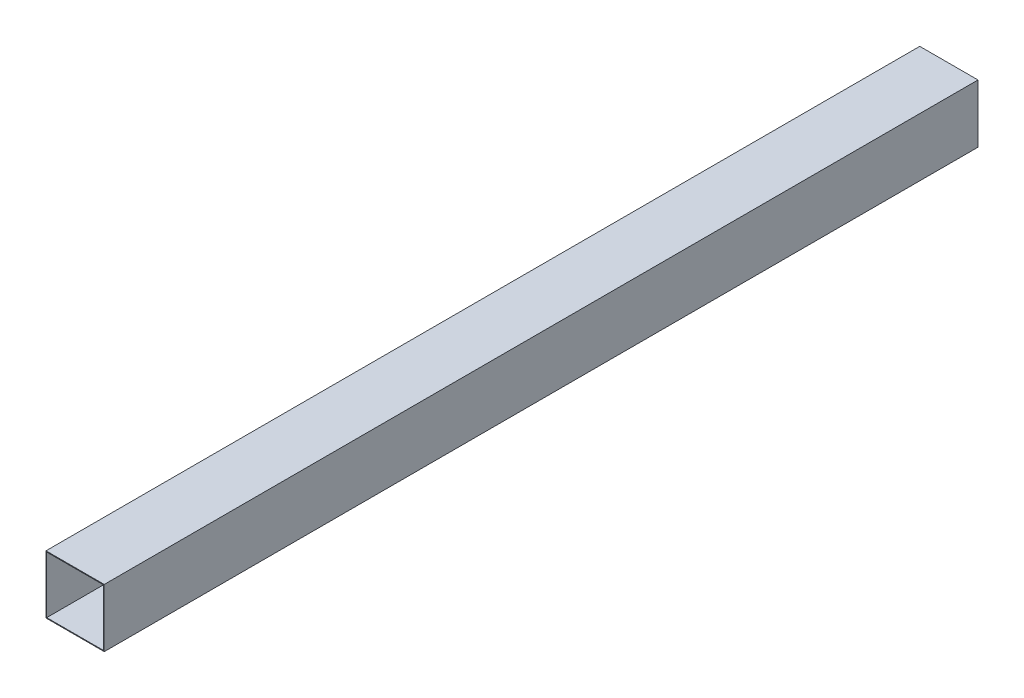
ISO-10303-21;
HEADER;
FILE_DESCRIPTION(('STEP AP214'),'2;1');
FILE_NAME('part.step','',(''),(''),'','','');
FILE_SCHEMA(('AUTOMOTIVE_DESIGN { 1 0 10303 214 1 1 1 1 }'));
ENDSEC;
DATA;
#1=APPLICATION_CONTEXT('core data for automotive mechanical design processes');
#2=APPLICATION_PROTOCOL_DEFINITION('international standard','automotive_design',2000,#1);
#3=PRODUCT_CONTEXT('',#1,'mechanical');
#4=PRODUCT('Part','Part','',(#3));
#5=PRODUCT_RELATED_PRODUCT_CATEGORY('part','',(#4));
#6=PRODUCT_DEFINITION_FORMATION('','',#4);
#7=PRODUCT_DEFINITION_CONTEXT('part definition',#1,'design');
#8=PRODUCT_DEFINITION('design','',#6,#7);
#9=PRODUCT_DEFINITION_SHAPE('','',#8);
#10=(LENGTH_UNIT() NAMED_UNIT(*) SI_UNIT(.MILLI.,.METRE.));
#11=(NAMED_UNIT(*) PLANE_ANGLE_UNIT() SI_UNIT($,.RADIAN.));
#12=(NAMED_UNIT(*) SI_UNIT($,.STERADIAN.) SOLID_ANGLE_UNIT());
#13=UNCERTAINTY_MEASURE_WITH_UNIT(LENGTH_MEASURE(1.E-05),#10,'distance_accuracy_value','');
#14=(GEOMETRIC_REPRESENTATION_CONTEXT(3) GLOBAL_UNCERTAINTY_ASSIGNED_CONTEXT((#13)) GLOBAL_UNIT_ASSIGNED_CONTEXT((#10,
#11,#12)) REPRESENTATION_CONTEXT('',''));
#15=CARTESIAN_POINT('',(0.,0.,0.));
#16=DIRECTION('',(0.,0.,1.));
#17=DIRECTION('',(1.,0.,0.));
#18=AXIS2_PLACEMENT_3D('',#15,#16,#17);
#19=CARTESIAN_POINT('',(0.,0.,600.));
#20=DIRECTION('',(0.,0.,1.));
#21=DIRECTION('',(1.,0.,0.));
#22=AXIS2_PLACEMENT_3D('',#19,#20,#21);
#23=PLANE('',#22);
#24=DIRECTION('',(0.,1.,0.));
#25=VECTOR('',#24,1.);
#26=CARTESIAN_POINT('',(20.,20.,600.));
#27=LINE('',#26,#25);
#28=CARTESIAN_POINT('',(20.,-20.,600.));
#29=VERTEX_POINT('',#28);
#30=CARTESIAN_POINT('',(20.,20.,600.));
#31=VERTEX_POINT('',#30);
#32=EDGE_CURVE('E138',#29,#31,#27,.T.);
#33=ORIENTED_EDGE('',*,*,#32,.T.);
#34=DIRECTION('',(-1.,0.,0.));
#35=VECTOR('',#34,1.);
#36=CARTESIAN_POINT('',(-20.,20.,600.));
#37=LINE('',#36,#35);
#38=CARTESIAN_POINT('',(-20.,20.,600.));
#39=VERTEX_POINT('',#38);
#40=EDGE_CURVE('E141',#31,#39,#37,.T.);
#41=ORIENTED_EDGE('',*,*,#40,.T.);
#42=DIRECTION('',(0.,-1.,0.));
#43=VECTOR('',#42,1.);
#44=CARTESIAN_POINT('',(-20.,20.,600.));
#45=LINE('',#44,#43);
#46=CARTESIAN_POINT('',(-20.,-20.,600.));
#47=VERTEX_POINT('',#46);
#48=EDGE_CURVE('E144',#39,#47,#45,.T.);
#49=ORIENTED_EDGE('',*,*,#48,.T.);
#50=DIRECTION('',(1.,0.,0.));
#51=VECTOR('',#50,1.);
#52=CARTESIAN_POINT('',(-20.,-20.,600.));
#53=LINE('',#52,#51);
#54=EDGE_CURVE('E146',#47,#29,#53,.T.);
#55=ORIENTED_EDGE('',*,*,#54,.T.);
#56=EDGE_LOOP('',(#33,#41,#49,#55));
#57=FACE_BOUND('',#56,.T.);
#58=DIRECTION('',(-1.,0.,0.));
#59=VECTOR('',#58,1.);
#60=CARTESIAN_POINT('',(-19.5,19.5,600.));
#61=LINE('',#60,#59);
#62=CARTESIAN_POINT('',(19.5,19.5,600.));
#63=VERTEX_POINT('',#62);
#64=CARTESIAN_POINT('',(-19.5,19.5,600.));
#65=VERTEX_POINT('',#64);
#66=EDGE_CURVE('E110',#63,#65,#61,.T.);
#67=ORIENTED_EDGE('',*,*,#66,.F.);
#68=DIRECTION('',(0.,1.,0.));
#69=VECTOR('',#68,1.);
#70=CARTESIAN_POINT('',(19.5,19.5,600.));
#71=LINE('',#70,#69);
#72=CARTESIAN_POINT('',(19.5,-19.5,600.));
#73=VERTEX_POINT('',#72);
#74=EDGE_CURVE('E102',#73,#63,#71,.T.);
#75=ORIENTED_EDGE('',*,*,#74,.F.);
#76=DIRECTION('',(1.,0.,0.));
#77=VECTOR('',#76,1.);
#78=CARTESIAN_POINT('',(-19.5,-19.5,600.));
#79=LINE('',#78,#77);
#80=CARTESIAN_POINT('',(-19.5,-19.5,600.));
#81=VERTEX_POINT('',#80);
#82=EDGE_CURVE('E124',#81,#73,#79,.T.);
#83=ORIENTED_EDGE('',*,*,#82,.F.);
#84=DIRECTION('',(0.,-1.,0.));
#85=VECTOR('',#84,1.);
#86=CARTESIAN_POINT('',(-19.5,19.5,600.));
#87=LINE('',#86,#85);
#88=EDGE_CURVE('E122',#65,#81,#87,.T.);
#89=ORIENTED_EDGE('',*,*,#88,.F.);
#90=EDGE_LOOP('',(#67,#75,#83,#89));
#91=FACE_BOUND('',#90,.T.);
#92=ADVANCED_FACE('F37',(#57,#91),#23,.T.);
#93=CARTESIAN_POINT('',(0.,0.,0.));
#94=DIRECTION('',(0.,0.,1.));
#95=DIRECTION('',(1.,0.,0.));
#96=AXIS2_PLACEMENT_3D('',#93,#94,#95);
#97=PLANE('',#96);
#98=DIRECTION('',(0.,1.,0.));
#99=VECTOR('',#98,1.);
#100=CARTESIAN_POINT('',(20.,20.,0.));
#101=LINE('',#100,#99);
#102=CARTESIAN_POINT('',(20.,-20.,0.));
#103=VERTEX_POINT('',#102);
#104=CARTESIAN_POINT('',(20.,20.,0.));
#105=VERTEX_POINT('',#104);
#106=EDGE_CURVE('E118',#103,#105,#101,.T.);
#107=ORIENTED_EDGE('',*,*,#106,.F.);
#108=DIRECTION('',(1.,0.,0.));
#109=VECTOR('',#108,1.);
#110=CARTESIAN_POINT('',(-20.,-20.,0.));
#111=LINE('',#110,#109);
#112=CARTESIAN_POINT('',(-20.,-20.,0.));
#113=VERTEX_POINT('',#112);
#114=EDGE_CURVE('E142',#113,#103,#111,.T.);
#115=ORIENTED_EDGE('',*,*,#114,.F.);
#116=DIRECTION('',(0.,-1.,0.));
#117=VECTOR('',#116,1.);
#118=CARTESIAN_POINT('',(-20.,20.,0.));
#119=LINE('',#118,#117);
#120=CARTESIAN_POINT('',(-20.,20.,0.));
#121=VERTEX_POINT('',#120);
#122=EDGE_CURVE('E153',#121,#113,#119,.T.);
#123=ORIENTED_EDGE('',*,*,#122,.F.);
#124=DIRECTION('',(-1.,0.,0.));
#125=VECTOR('',#124,1.);
#126=CARTESIAN_POINT('',(-20.,20.,0.));
#127=LINE('',#126,#125);
#128=EDGE_CURVE('E151',#105,#121,#127,.T.);
#129=ORIENTED_EDGE('',*,*,#128,.F.);
#130=EDGE_LOOP('',(#107,#115,#123,#129));
#131=FACE_BOUND('',#130,.T.);
#132=DIRECTION('',(0.,1.,0.));
#133=VECTOR('',#132,1.);
#134=CARTESIAN_POINT('',(19.5,19.5,0.));
#135=LINE('',#134,#133);
#136=CARTESIAN_POINT('',(19.5,-19.5,0.));
#137=VERTEX_POINT('',#136);
#138=CARTESIAN_POINT('',(19.5,19.5,0.));
#139=VERTEX_POINT('',#138);
#140=EDGE_CURVE('E60',#137,#139,#135,.T.);
#141=ORIENTED_EDGE('',*,*,#140,.T.);
#142=DIRECTION('',(-1.,0.,0.));
#143=VECTOR('',#142,1.);
#144=CARTESIAN_POINT('',(-19.5,19.5,0.));
#145=LINE('',#144,#143);
#146=CARTESIAN_POINT('',(-19.5,19.5,0.));
#147=VERTEX_POINT('',#146);
#148=EDGE_CURVE('E117',#139,#147,#145,.T.);
#149=ORIENTED_EDGE('',*,*,#148,.T.);
#150=DIRECTION('',(0.,-1.,0.));
#151=VECTOR('',#150,1.);
#152=CARTESIAN_POINT('',(-19.5,19.5,0.));
#153=LINE('',#152,#151);
#154=CARTESIAN_POINT('',(-19.5,-19.5,0.));
#155=VERTEX_POINT('',#154);
#156=EDGE_CURVE('E130',#147,#155,#153,.T.);
#157=ORIENTED_EDGE('',*,*,#156,.T.);
#158=DIRECTION('',(1.,0.,0.));
#159=VECTOR('',#158,1.);
#160=CARTESIAN_POINT('',(-19.5,-19.5,0.));
#161=LINE('',#160,#159);
#162=EDGE_CURVE('E111',#155,#137,#161,.T.);
#163=ORIENTED_EDGE('',*,*,#162,.T.);
#164=EDGE_LOOP('',(#141,#149,#157,#163));
#165=FACE_BOUND('',#164,.T.);
#166=ADVANCED_FACE('F171',(#131,#165),#97,.F.);
#167=CARTESIAN_POINT('',(20.,20.,600.));
#168=DIRECTION('',(-1.,0.,0.));
#169=DIRECTION('',(0.,0.,1.));
#170=AXIS2_PLACEMENT_3D('',#167,#168,#169);
#171=PLANE('',#170);
#172=ORIENTED_EDGE('',*,*,#106,.T.);
#173=DIRECTION('',(0.,0.,-1.));
#174=VECTOR('',#173,1.);
#175=CARTESIAN_POINT('',(20.,20.,600.));
#176=LINE('',#175,#174);
#177=EDGE_CURVE('E11',#31,#105,#176,.T.);
#178=ORIENTED_EDGE('',*,*,#177,.F.);
#179=ORIENTED_EDGE('',*,*,#32,.F.);
#180=DIRECTION('',(0.,0.,-1.));
#181=VECTOR('',#180,1.);
#182=CARTESIAN_POINT('',(20.,-20.,600.));
#183=LINE('',#182,#181);
#184=EDGE_CURVE('E148',#29,#103,#183,.T.);
#185=ORIENTED_EDGE('',*,*,#184,.T.);
#186=EDGE_LOOP('',(#172,#178,#179,#185));
#187=FACE_BOUND('',#186,.T.);
#188=ADVANCED_FACE('F39',(#187),#171,.F.);
#189=CARTESIAN_POINT('',(-20.,20.,600.));
#190=DIRECTION('',(0.,-1.,0.));
#191=DIRECTION('',(0.,0.,-1.));
#192=AXIS2_PLACEMENT_3D('',#189,#190,#191);
#193=PLANE('',#192);
#194=ORIENTED_EDGE('',*,*,#128,.T.);
#195=DIRECTION('',(0.,0.,-1.));
#196=VECTOR('',#195,1.);
#197=CARTESIAN_POINT('',(-20.,20.,600.));
#198=LINE('',#197,#196);
#199=EDGE_CURVE('E45',#39,#121,#198,.T.);
#200=ORIENTED_EDGE('',*,*,#199,.F.);
#201=ORIENTED_EDGE('',*,*,#40,.F.);
#202=ORIENTED_EDGE('',*,*,#177,.T.);
#203=EDGE_LOOP('',(#194,#200,#201,#202));
#204=FACE_BOUND('',#203,.T.);
#205=ADVANCED_FACE('F181',(#204),#193,.F.);
#206=CARTESIAN_POINT('',(-20.,20.,600.));
#207=DIRECTION('',(1.,0.,0.));
#208=DIRECTION('',(0.,1.,0.));
#209=AXIS2_PLACEMENT_3D('',#206,#207,#208);
#210=PLANE('',#209);
#211=ORIENTED_EDGE('',*,*,#122,.T.);
#212=DIRECTION('',(0.,0.,-1.));
#213=VECTOR('',#212,1.);
#214=CARTESIAN_POINT('',(-20.,-20.,600.));
#215=LINE('',#214,#213);
#216=EDGE_CURVE('E158',#47,#113,#215,.T.);
#217=ORIENTED_EDGE('',*,*,#216,.F.);
#218=ORIENTED_EDGE('',*,*,#48,.F.);
#219=ORIENTED_EDGE('',*,*,#199,.T.);
#220=EDGE_LOOP('',(#211,#217,#218,#219));
#221=FACE_BOUND('',#220,.T.);
#222=ADVANCED_FACE('F165',(#221),#210,.F.);
#223=CARTESIAN_POINT('',(-20.,-20.,600.));
#224=DIRECTION('',(0.,1.,0.));
#225=DIRECTION('',(0.,0.,1.));
#226=AXIS2_PLACEMENT_3D('',#223,#224,#225);
#227=PLANE('',#226);
#228=ORIENTED_EDGE('',*,*,#114,.T.);
#229=ORIENTED_EDGE('',*,*,#184,.F.);
#230=ORIENTED_EDGE('',*,*,#54,.F.);
#231=ORIENTED_EDGE('',*,*,#216,.T.);
#232=EDGE_LOOP('',(#228,#229,#230,#231));
#233=FACE_BOUND('',#232,.T.);
#234=ADVANCED_FACE('F175',(#233),#227,.F.);
#235=CARTESIAN_POINT('',(19.5,19.5,600.));
#236=DIRECTION('',(-1.,0.,0.));
#237=DIRECTION('',(0.,-1.,0.));
#238=AXIS2_PLACEMENT_3D('',#235,#236,#237);
#239=PLANE('',#238);
#240=ORIENTED_EDGE('',*,*,#140,.F.);
#241=DIRECTION('',(0.,0.,-1.));
#242=VECTOR('',#241,1.);
#243=CARTESIAN_POINT('',(19.5,-19.5,600.));
#244=LINE('',#243,#242);
#245=EDGE_CURVE('E106',#73,#137,#244,.T.);
#246=ORIENTED_EDGE('',*,*,#245,.F.);
#247=ORIENTED_EDGE('',*,*,#74,.T.);
#248=DIRECTION('',(0.,0.,-1.));
#249=VECTOR('',#248,1.);
#250=CARTESIAN_POINT('',(19.5,19.5,600.));
#251=LINE('',#250,#249);
#252=EDGE_CURVE('E105',#63,#139,#251,.T.);
#253=ORIENTED_EDGE('',*,*,#252,.T.);
#254=EDGE_LOOP('',(#240,#246,#247,#253));
#255=FACE_BOUND('',#254,.T.);
#256=ADVANCED_FACE('F104',(#255),#239,.T.);
#257=CARTESIAN_POINT('',(-19.5,19.5,600.));
#258=DIRECTION('',(0.,-1.,0.));
#259=DIRECTION('',(0.,0.,-1.));
#260=AXIS2_PLACEMENT_3D('',#257,#258,#259);
#261=PLANE('',#260);
#262=ORIENTED_EDGE('',*,*,#148,.F.);
#263=ORIENTED_EDGE('',*,*,#252,.F.);
#264=ORIENTED_EDGE('',*,*,#66,.T.);
#265=DIRECTION('',(0.,0.,-1.));
#266=VECTOR('',#265,1.);
#267=CARTESIAN_POINT('',(-19.5,19.5,600.));
#268=LINE('',#267,#266);
#269=EDGE_CURVE('E119',#65,#147,#268,.T.);
#270=ORIENTED_EDGE('',*,*,#269,.T.);
#271=EDGE_LOOP('',(#262,#263,#264,#270));
#272=FACE_BOUND('',#271,.T.);
#273=ADVANCED_FACE('F114',(#272),#261,.T.);
#274=CARTESIAN_POINT('',(-19.5,19.5,600.));
#275=DIRECTION('',(1.,0.,0.));
#276=DIRECTION('',(0.,1.,0.));
#277=AXIS2_PLACEMENT_3D('',#274,#275,#276);
#278=PLANE('',#277);
#279=ORIENTED_EDGE('',*,*,#156,.F.);
#280=ORIENTED_EDGE('',*,*,#269,.F.);
#281=ORIENTED_EDGE('',*,*,#88,.T.);
#282=DIRECTION('',(0.,0.,-1.));
#283=VECTOR('',#282,1.);
#284=CARTESIAN_POINT('',(-19.5,-19.5,600.));
#285=LINE('',#284,#283);
#286=EDGE_CURVE('E52',#81,#155,#285,.T.);
#287=ORIENTED_EDGE('',*,*,#286,.T.);
#288=EDGE_LOOP('',(#279,#280,#281,#287));
#289=FACE_BOUND('',#288,.T.);
#290=ADVANCED_FACE('F204',(#289),#278,.T.);
#291=CARTESIAN_POINT('',(-19.5,-19.5,600.));
#292=DIRECTION('',(0.,1.,0.));
#293=DIRECTION('',(0.,0.,1.));
#294=AXIS2_PLACEMENT_3D('',#291,#292,#293);
#295=PLANE('',#294);
#296=ORIENTED_EDGE('',*,*,#162,.F.);
#297=ORIENTED_EDGE('',*,*,#286,.F.);
#298=ORIENTED_EDGE('',*,*,#82,.T.);
#299=ORIENTED_EDGE('',*,*,#245,.T.);
#300=EDGE_LOOP('',(#296,#297,#298,#299));
#301=FACE_BOUND('',#300,.T.);
#302=ADVANCED_FACE('F208',(#301),#295,.T.);
#303=CLOSED_SHELL('',(#92,#166,#188,#205,#222,#234,#256,#273,#290,#302));
#304=MANIFOLD_SOLID_BREP('B2',#303);
#305=ADVANCED_BREP_SHAPE_REPRESENTATION('',(#18,#304),#14);
#306=SHAPE_DEFINITION_REPRESENTATION(#9,#305);
ENDSEC;
END-ISO-10303-21;
